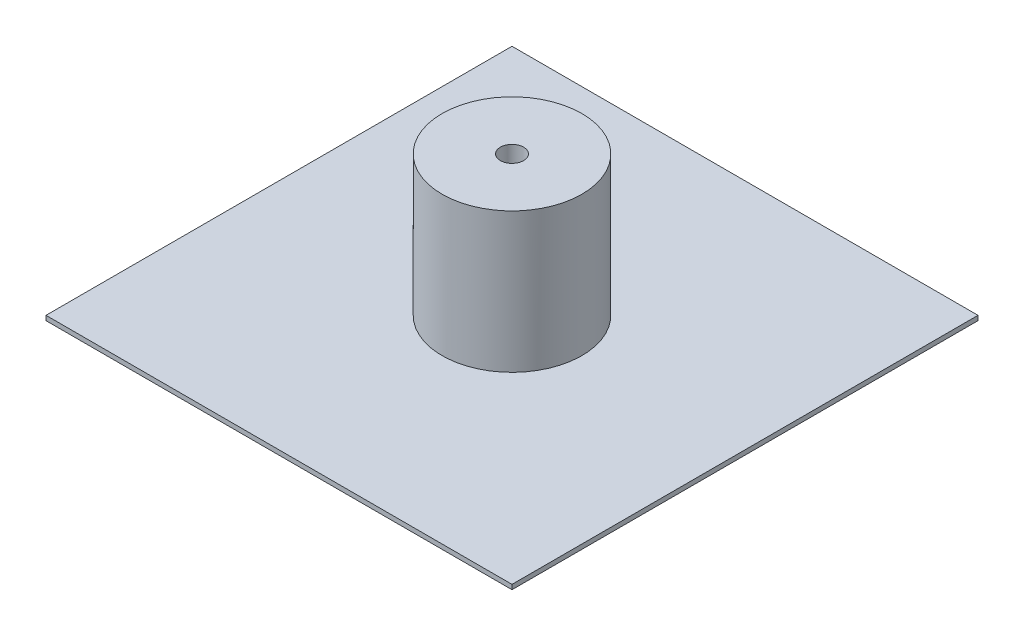
ISO-10303-21;
HEADER;
FILE_DESCRIPTION(('STEP AP214'),'2;1');
FILE_NAME('part.step','',(''),(''),'','','');
FILE_SCHEMA(('AUTOMOTIVE_DESIGN { 1 0 10303 214 1 1 1 1 }'));
ENDSEC;
DATA;
#1=APPLICATION_CONTEXT('core data for automotive mechanical design processes');
#2=APPLICATION_PROTOCOL_DEFINITION('international standard','automotive_design',2000,#1);
#3=PRODUCT_CONTEXT('',#1,'mechanical');
#4=PRODUCT('Part','Part','',(#3));
#5=PRODUCT_RELATED_PRODUCT_CATEGORY('part','',(#4));
#6=PRODUCT_DEFINITION_FORMATION('','',#4);
#7=PRODUCT_DEFINITION_CONTEXT('part definition',#1,'design');
#8=PRODUCT_DEFINITION('design','',#6,#7);
#9=PRODUCT_DEFINITION_SHAPE('','',#8);
#10=(LENGTH_UNIT() NAMED_UNIT(*) SI_UNIT(.MILLI.,.METRE.));
#11=(NAMED_UNIT(*) PLANE_ANGLE_UNIT() SI_UNIT($,.RADIAN.));
#12=(NAMED_UNIT(*) SI_UNIT($,.STERADIAN.) SOLID_ANGLE_UNIT());
#13=UNCERTAINTY_MEASURE_WITH_UNIT(LENGTH_MEASURE(1.E-05),#10,'distance_accuracy_value','');
#14=(GEOMETRIC_REPRESENTATION_CONTEXT(3) GLOBAL_UNCERTAINTY_ASSIGNED_CONTEXT((#13)) GLOBAL_UNIT_ASSIGNED_CONTEXT((#10,
#11,#12)) REPRESENTATION_CONTEXT('',''));
#15=CARTESIAN_POINT('',(0.,0.,0.));
#16=DIRECTION('',(0.,0.,1.));
#17=DIRECTION('',(1.,0.,0.));
#18=AXIS2_PLACEMENT_3D('',#15,#16,#17);
#19=CARTESIAN_POINT('',(500.,10.,500.));
#20=DIRECTION('',(-1.,0.,0.));
#21=DIRECTION('',(0.,0.,1.));
#22=AXIS2_PLACEMENT_3D('',#19,#20,#21);
#23=PLANE('',#22);
#24=DIRECTION('',(0.,0.,-1.));
#25=VECTOR('',#24,1.);
#26=CARTESIAN_POINT('',(500.,0.,500.));
#27=LINE('',#26,#25);
#28=CARTESIAN_POINT('',(500.,0.,500.));
#29=VERTEX_POINT('',#28);
#30=CARTESIAN_POINT('',(500.,0.,-500.));
#31=VERTEX_POINT('',#30);
#32=EDGE_CURVE('E99',#29,#31,#27,.T.);
#33=ORIENTED_EDGE('',*,*,#32,.T.);
#34=DIRECTION('',(0.,-1.,0.));
#35=VECTOR('',#34,1.);
#36=CARTESIAN_POINT('',(500.,10.,-500.));
#37=LINE('',#36,#35);
#38=CARTESIAN_POINT('',(500.,10.,-500.));
#39=VERTEX_POINT('',#38);
#40=EDGE_CURVE('E41',#39,#31,#37,.T.);
#41=ORIENTED_EDGE('',*,*,#40,.F.);
#42=DIRECTION('',(0.,0.,-1.));
#43=VECTOR('',#42,1.);
#44=CARTESIAN_POINT('',(500.,10.,500.));
#45=LINE('',#44,#43);
#46=CARTESIAN_POINT('',(500.,10.,500.));
#47=VERTEX_POINT('',#46);
#48=EDGE_CURVE('E85',#47,#39,#45,.T.);
#49=ORIENTED_EDGE('',*,*,#48,.F.);
#50=DIRECTION('',(0.,-1.,0.));
#51=VECTOR('',#50,1.);
#52=CARTESIAN_POINT('',(500.,10.,500.));
#53=LINE('',#52,#51);
#54=EDGE_CURVE('E95',#47,#29,#53,.T.);
#55=ORIENTED_EDGE('',*,*,#54,.T.);
#56=EDGE_LOOP('',(#33,#41,#49,#55));
#57=FACE_BOUND('',#56,.T.);
#58=ADVANCED_FACE('F33',(#57),#23,.F.);
#59=CARTESIAN_POINT('',(-500.,10.,-500.));
#60=DIRECTION('',(0.,0.,1.));
#61=DIRECTION('',(1.,0.,0.));
#62=AXIS2_PLACEMENT_3D('',#59,#60,#61);
#63=PLANE('',#62);
#64=DIRECTION('',(-1.,0.,0.));
#65=VECTOR('',#64,1.);
#66=CARTESIAN_POINT('',(-500.,0.,-500.));
#67=LINE('',#66,#65);
#68=CARTESIAN_POINT('',(-500.,0.,-500.));
#69=VERTEX_POINT('',#68);
#70=EDGE_CURVE('E90',#31,#69,#67,.T.);
#71=ORIENTED_EDGE('',*,*,#70,.T.);
#72=DIRECTION('',(0.,-1.,0.));
#73=VECTOR('',#72,1.);
#74=CARTESIAN_POINT('',(-500.,10.,-500.));
#75=LINE('',#74,#73);
#76=CARTESIAN_POINT('',(-500.,10.,-500.));
#77=VERTEX_POINT('',#76);
#78=EDGE_CURVE('E88',#77,#69,#75,.T.);
#79=ORIENTED_EDGE('',*,*,#78,.F.);
#80=DIRECTION('',(-1.,0.,0.));
#81=VECTOR('',#80,1.);
#82=CARTESIAN_POINT('',(-500.,10.,-500.));
#83=LINE('',#82,#81);
#84=EDGE_CURVE('E80',#39,#77,#83,.T.);
#85=ORIENTED_EDGE('',*,*,#84,.F.);
#86=ORIENTED_EDGE('',*,*,#40,.T.);
#87=EDGE_LOOP('',(#71,#79,#85,#86));
#88=FACE_BOUND('',#87,.T.);
#89=ADVANCED_FACE('F89',(#88),#63,.F.);
#90=CARTESIAN_POINT('',(-500.,10.,500.));
#91=DIRECTION('',(1.,0.,0.));
#92=DIRECTION('',(0.,0.,-1.));
#93=AXIS2_PLACEMENT_3D('',#90,#91,#92);
#94=PLANE('',#93);
#95=DIRECTION('',(0.,0.,1.));
#96=VECTOR('',#95,1.);
#97=CARTESIAN_POINT('',(-500.,0.,500.));
#98=LINE('',#97,#96);
#99=CARTESIAN_POINT('',(-500.,0.,500.));
#100=VERTEX_POINT('',#99);
#101=EDGE_CURVE('E66',#69,#100,#98,.T.);
#102=ORIENTED_EDGE('',*,*,#101,.T.);
#103=DIRECTION('',(0.,-1.,0.));
#104=VECTOR('',#103,1.);
#105=CARTESIAN_POINT('',(-500.,10.,500.));
#106=LINE('',#105,#104);
#107=CARTESIAN_POINT('',(-500.,10.,500.));
#108=VERTEX_POINT('',#107);
#109=EDGE_CURVE('E91',#108,#100,#106,.T.);
#110=ORIENTED_EDGE('',*,*,#109,.F.);
#111=DIRECTION('',(0.,0.,1.));
#112=VECTOR('',#111,1.);
#113=CARTESIAN_POINT('',(-500.,10.,500.));
#114=LINE('',#113,#112);
#115=EDGE_CURVE('E83',#77,#108,#114,.T.);
#116=ORIENTED_EDGE('',*,*,#115,.F.);
#117=ORIENTED_EDGE('',*,*,#78,.T.);
#118=EDGE_LOOP('',(#102,#110,#116,#117));
#119=FACE_BOUND('',#118,.T.);
#120=ADVANCED_FACE('F93',(#119),#94,.F.);
#121=CARTESIAN_POINT('',(-500.,10.,500.));
#122=DIRECTION('',(0.,0.,-1.));
#123=DIRECTION('',(-1.,0.,0.));
#124=AXIS2_PLACEMENT_3D('',#121,#122,#123);
#125=PLANE('',#124);
#126=DIRECTION('',(1.,0.,0.));
#127=VECTOR('',#126,1.);
#128=CARTESIAN_POINT('',(-500.,0.,500.));
#129=LINE('',#128,#127);
#130=EDGE_CURVE('E72',#100,#29,#129,.T.);
#131=ORIENTED_EDGE('',*,*,#130,.T.);
#132=ORIENTED_EDGE('',*,*,#54,.F.);
#133=DIRECTION('',(1.,0.,0.));
#134=VECTOR('',#133,1.);
#135=CARTESIAN_POINT('',(-500.,10.,500.));
#136=LINE('',#135,#134);
#137=EDGE_CURVE('E49',#108,#47,#136,.T.);
#138=ORIENTED_EDGE('',*,*,#137,.F.);
#139=ORIENTED_EDGE('',*,*,#109,.T.);
#140=EDGE_LOOP('',(#131,#132,#138,#139));
#141=FACE_BOUND('',#140,.T.);
#142=ADVANCED_FACE('F121',(#141),#125,.F.);
#143=CARTESIAN_POINT('',(0.,10.,0.));
#144=DIRECTION('',(0.,-1.,0.));
#145=DIRECTION('',(0.,0.,-1.));
#146=AXIS2_PLACEMENT_3D('',#143,#144,#145);
#147=PLANE('',#146);
#148=CARTESIAN_POINT('',(0.,10.,0.));
#149=DIRECTION('',(0.,-1.,0.));
#150=DIRECTION('',(0.,0.,-1.));
#151=AXIS2_PLACEMENT_3D('',#148,#149,#150);
#152=CIRCLE('',#151,150.);
#153=CARTESIAN_POINT('',(0.,10.,-150.));
#154=VERTEX_POINT('',#153);
#155=EDGE_CURVE('E11',#154,#154,#152,.F.);
#156=ORIENTED_EDGE('',*,*,#155,.F.);
#157=EDGE_LOOP('',(#156));
#158=FACE_BOUND('',#157,.T.);
#159=ORIENTED_EDGE('',*,*,#48,.T.);
#160=ORIENTED_EDGE('',*,*,#84,.T.);
#161=ORIENTED_EDGE('',*,*,#115,.T.);
#162=ORIENTED_EDGE('',*,*,#137,.T.);
#163=EDGE_LOOP('',(#159,#160,#161,#162));
#164=FACE_BOUND('',#163,.T.);
#165=ADVANCED_FACE('F81',(#158,#164),#147,.F.);
#166=CARTESIAN_POINT('',(0.,0.,0.));
#167=DIRECTION('',(0.,-1.,0.));
#168=DIRECTION('',(0.,0.,-1.));
#169=AXIS2_PLACEMENT_3D('',#166,#167,#168);
#170=PLANE('',#169);
#171=ORIENTED_EDGE('',*,*,#32,.F.);
#172=ORIENTED_EDGE('',*,*,#130,.F.);
#173=ORIENTED_EDGE('',*,*,#101,.F.);
#174=ORIENTED_EDGE('',*,*,#70,.F.);
#175=EDGE_LOOP('',(#171,#172,#173,#174));
#176=FACE_BOUND('',#175,.T.);
#177=ADVANCED_FACE('F110',(#176),#170,.T.);
#178=CARTESIAN_POINT('',(0.,310.,0.));
#179=DIRECTION('',(0.,-1.,0.));
#180=DIRECTION('',(0.,0.,-1.));
#181=AXIS2_PLACEMENT_3D('',#178,#179,#180);
#182=CYLINDRICAL_SURFACE('',#181,150.);
#183=CARTESIAN_POINT('',(0.,310.,0.));
#184=DIRECTION('',(0.,1.,0.));
#185=DIRECTION('',(0.,0.,1.));
#186=AXIS2_PLACEMENT_3D('',#183,#184,#185);
#187=CIRCLE('',#186,150.);
#188=CARTESIAN_POINT('',(0.,310.,150.));
#189=VERTEX_POINT('',#188);
#190=EDGE_CURVE('E102',#189,#189,#187,.T.);
#191=ORIENTED_EDGE('',*,*,#190,.F.);
#192=EDGE_LOOP('',(#191));
#193=FACE_BOUND('',#192,.T.);
#194=ORIENTED_EDGE('',*,*,#155,.T.);
#195=EDGE_LOOP('',(#194));
#196=FACE_BOUND('',#195,.T.);
#197=ADVANCED_FACE('F112',(#193,#196),#182,.T.);
#198=CARTESIAN_POINT('',(0.,310.,0.));
#199=DIRECTION('',(0.,1.,0.));
#200=DIRECTION('',(0.,0.,1.));
#201=AXIS2_PLACEMENT_3D('',#198,#199,#200);
#202=PLANE('',#201);
#203=CARTESIAN_POINT('',(0.,310.,0.));
#204=DIRECTION('',(0.,1.,0.));
#205=DIRECTION('',(0.,0.,1.));
#206=AXIS2_PLACEMENT_3D('',#203,#204,#205);
#207=CIRCLE('',#206,25.);
#208=CARTESIAN_POINT('',(0.,310.,25.));
#209=VERTEX_POINT('',#208);
#210=EDGE_CURVE('E186',#209,#209,#207,.T.);
#211=ORIENTED_EDGE('',*,*,#210,.F.);
#212=EDGE_LOOP('',(#211));
#213=FACE_BOUND('',#212,.T.);
#214=ORIENTED_EDGE('',*,*,#190,.T.);
#215=EDGE_LOOP('',(#214));
#216=FACE_BOUND('',#215,.T.);
#217=ADVANCED_FACE('F118',(#213,#216),#202,.T.);
#218=CARTESIAN_POINT('',(0.,260.,0.));
#219=DIRECTION('',(0.,1.,0.));
#220=DIRECTION('',(0.,0.,1.));
#221=AXIS2_PLACEMENT_3D('',#218,#219,#220);
#222=CYLINDRICAL_SURFACE('',#221,25.);
#223=CARTESIAN_POINT('',(0.,260.,0.));
#224=DIRECTION('',(0.,1.,0.));
#225=DIRECTION('',(0.,0.,1.));
#226=AXIS2_PLACEMENT_3D('',#223,#224,#225);
#227=CIRCLE('',#226,25.);
#228=CARTESIAN_POINT('',(0.,260.,25.));
#229=VERTEX_POINT('',#228);
#230=EDGE_CURVE('E185',#229,#229,#227,.T.);
#231=ORIENTED_EDGE('',*,*,#230,.F.);
#232=EDGE_LOOP('',(#231));
#233=FACE_BOUND('',#232,.T.);
#234=ORIENTED_EDGE('',*,*,#210,.T.);
#235=EDGE_LOOP('',(#234));
#236=FACE_BOUND('',#235,.T.);
#237=ADVANCED_FACE('F159',(#233,#236),#222,.F.);
#238=CARTESIAN_POINT('',(0.,260.,0.));
#239=DIRECTION('',(0.,1.,0.));
#240=DIRECTION('',(0.,0.,1.));
#241=AXIS2_PLACEMENT_3D('',#238,#239,#240);
#242=PLANE('',#241);
#243=ORIENTED_EDGE('',*,*,#230,.T.);
#244=EDGE_LOOP('',(#243));
#245=FACE_BOUND('',#244,.T.);
#246=ADVANCED_FACE('F169',(#245),#242,.T.);
#247=CLOSED_SHELL('',(#58,#89,#120,#142,#165,#177,#197,#217,#237,#246));
#248=MANIFOLD_SOLID_BREP('B2',#247);
#249=ADVANCED_BREP_SHAPE_REPRESENTATION('',(#18,#248),#14);
#250=SHAPE_DEFINITION_REPRESENTATION(#9,#249);
ENDSEC;
END-ISO-10303-21;
